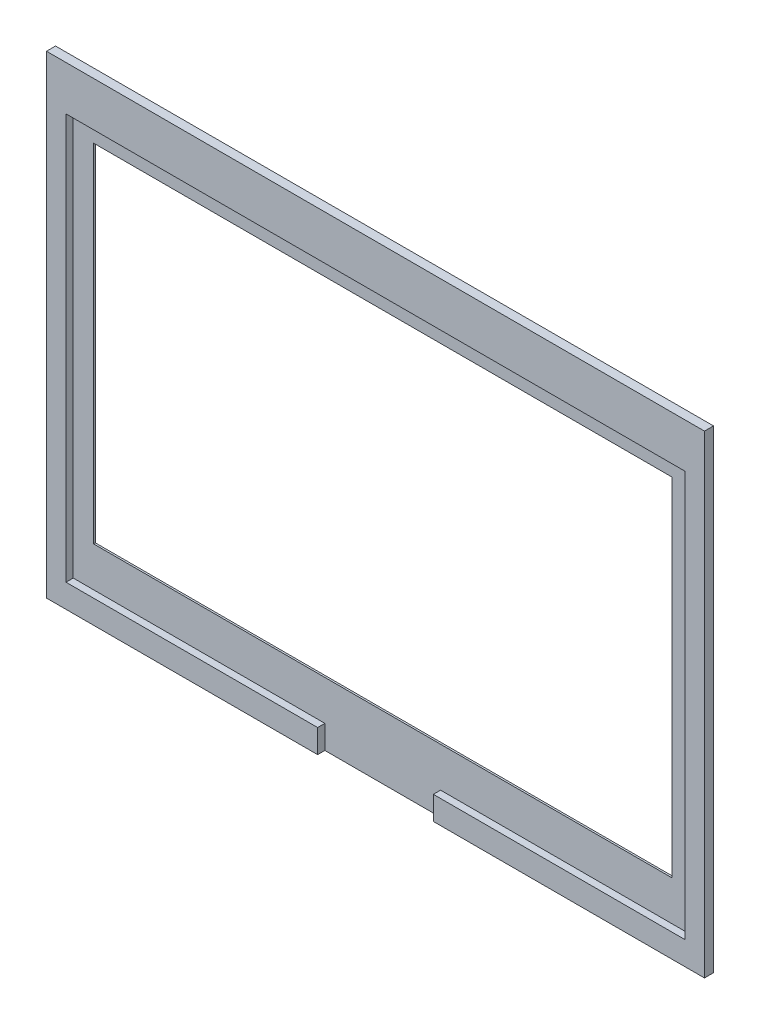
ISO-10303-21;
HEADER;
FILE_DESCRIPTION(('STEP AP214'),'2;1');
FILE_NAME('part.step','',(''),(''),'','','');
FILE_SCHEMA(('AUTOMOTIVE_DESIGN { 1 0 10303 214 1 1 1 1 }'));
ENDSEC;
DATA;
#1=APPLICATION_CONTEXT('core data for automotive mechanical design processes');
#2=APPLICATION_PROTOCOL_DEFINITION('international standard','automotive_design',2000,#1);
#3=PRODUCT_CONTEXT('',#1,'mechanical');
#4=PRODUCT('Part','Part','',(#3));
#5=PRODUCT_RELATED_PRODUCT_CATEGORY('part','',(#4));
#6=PRODUCT_DEFINITION_FORMATION('','',#4);
#7=PRODUCT_DEFINITION_CONTEXT('part definition',#1,'design');
#8=PRODUCT_DEFINITION('design','',#6,#7);
#9=PRODUCT_DEFINITION_SHAPE('','',#8);
#10=(LENGTH_UNIT() NAMED_UNIT(*) SI_UNIT(.MILLI.,.METRE.));
#11=(NAMED_UNIT(*) PLANE_ANGLE_UNIT() SI_UNIT($,.RADIAN.));
#12=(NAMED_UNIT(*) SI_UNIT($,.STERADIAN.) SOLID_ANGLE_UNIT());
#13=UNCERTAINTY_MEASURE_WITH_UNIT(LENGTH_MEASURE(1.E-05),#10,'distance_accuracy_value','');
#14=(GEOMETRIC_REPRESENTATION_CONTEXT(3) GLOBAL_UNCERTAINTY_ASSIGNED_CONTEXT((#13)) GLOBAL_UNIT_ASSIGNED_CONTEXT((#10,
#11,#12)) REPRESENTATION_CONTEXT('',''));
#15=CARTESIAN_POINT('',(0.,0.,0.));
#16=DIRECTION('',(0.,0.,1.));
#17=DIRECTION('',(1.,0.,0.));
#18=AXIS2_PLACEMENT_3D('',#15,#16,#17);
#19=CARTESIAN_POINT('',(0.,6.49999999999999,2.5));
#20=DIRECTION('',(0.,1.,0.));
#21=DIRECTION('',(0.,0.,1.));
#22=AXIS2_PLACEMENT_3D('',#19,#20,#21);
#23=PLANE('',#22);
#24=DIRECTION('',(0.,0.,1.));
#25=VECTOR('',#24,1.);
#26=CARTESIAN_POINT('',(75.,6.49999999999999,0.499999999999996));
#27=LINE('',#26,#25);
#28=CARTESIAN_POINT('',(75.,6.49999999999999,0.499999999999996));
#29=VERTEX_POINT('',#28);
#30=CARTESIAN_POINT('',(75.,6.49999999999999,2.5));
#31=VERTEX_POINT('',#30);
#32=EDGE_CURVE('E175',#29,#31,#27,.T.);
#33=ORIENTED_EDGE('',*,*,#32,.F.);
#34=DIRECTION('',(1.,0.,0.));
#35=VECTOR('',#34,1.);
#36=CARTESIAN_POINT('',(0.,6.49999999999999,0.5));
#37=LINE('',#36,#35);
#38=CARTESIAN_POINT('',(5.40000000000003,6.49999999999999,0.5));
#39=VERTEX_POINT('',#38);
#40=EDGE_CURVE('E189',#39,#29,#37,.T.);
#41=ORIENTED_EDGE('',*,*,#40,.F.);
#42=DIRECTION('',(0.,0.,-1.));
#43=VECTOR('',#42,1.);
#44=CARTESIAN_POINT('',(5.40000000000003,6.49999999999999,2.5));
#45=LINE('',#44,#43);
#46=CARTESIAN_POINT('',(5.40000000000003,6.49999999999999,2.5));
#47=VERTEX_POINT('',#46);
#48=EDGE_CURVE('E260',#47,#39,#45,.T.);
#49=ORIENTED_EDGE('',*,*,#48,.F.);
#50=DIRECTION('',(1.,0.,0.));
#51=VECTOR('',#50,1.);
#52=CARTESIAN_POINT('',(0.,6.49999999999999,2.5));
#53=LINE('',#52,#51);
#54=EDGE_CURVE('E240',#47,#31,#53,.T.);
#55=ORIENTED_EDGE('',*,*,#54,.T.);
#56=EDGE_LOOP('',(#33,#41,#49,#55));
#57=FACE_BOUND('',#56,.T.);
#58=ADVANCED_FACE('F37',(#57),#23,.T.);
#59=CARTESIAN_POINT('',(0.,118.7,2.5));
#60=DIRECTION('',(0.,1.,0.));
#61=DIRECTION('',(0.,0.,1.));
#62=AXIS2_PLACEMENT_3D('',#59,#60,#61);
#63=PLANE('',#62);
#64=DIRECTION('',(0.,0.,-1.));
#65=VECTOR('',#64,1.);
#66=CARTESIAN_POINT('',(5.40000000000001,118.7,2.5));
#67=LINE('',#66,#65);
#68=CARTESIAN_POINT('',(5.40000000000001,118.7,2.5));
#69=VERTEX_POINT('',#68);
#70=CARTESIAN_POINT('',(5.40000000000001,118.7,0.5));
#71=VERTEX_POINT('',#70);
#72=EDGE_CURVE('E258',#69,#71,#67,.T.);
#73=ORIENTED_EDGE('',*,*,#72,.T.);
#74=DIRECTION('',(1.,0.,0.));
#75=VECTOR('',#74,1.);
#76=CARTESIAN_POINT('',(0.,118.7,0.5));
#77=LINE('',#76,#75);
#78=CARTESIAN_POINT('',(176.6,118.7,0.5));
#79=VERTEX_POINT('',#78);
#80=EDGE_CURVE('E60',#71,#79,#77,.T.);
#81=ORIENTED_EDGE('',*,*,#80,.T.);
#82=DIRECTION('',(0.,0.,-1.));
#83=VECTOR('',#82,1.);
#84=CARTESIAN_POINT('',(176.6,118.7,2.5));
#85=LINE('',#84,#83);
#86=CARTESIAN_POINT('',(176.6,118.7,2.5));
#87=VERTEX_POINT('',#86);
#88=EDGE_CURVE('E266',#87,#79,#85,.T.);
#89=ORIENTED_EDGE('',*,*,#88,.F.);
#90=DIRECTION('',(1.,0.,0.));
#91=VECTOR('',#90,1.);
#92=CARTESIAN_POINT('',(0.,118.7,2.5));
#93=LINE('',#92,#91);
#94=EDGE_CURVE('E233',#69,#87,#93,.T.);
#95=ORIENTED_EDGE('',*,*,#94,.F.);
#96=EDGE_LOOP('',(#73,#81,#89,#95));
#97=FACE_BOUND('',#96,.T.);
#98=ADVANCED_FACE('F288',(#97),#63,.F.);
#99=CARTESIAN_POINT('',(176.6,0.,2.5));
#100=DIRECTION('',(1.,0.,0.));
#101=DIRECTION('',(0.,0.,-1.));
#102=AXIS2_PLACEMENT_3D('',#99,#100,#101);
#103=PLANE('',#102);
#104=ORIENTED_EDGE('',*,*,#88,.T.);
#105=DIRECTION('',(0.,-1.,0.));
#106=VECTOR('',#105,1.);
#107=CARTESIAN_POINT('',(176.6,0.,0.5));
#108=LINE('',#107,#106);
#109=CARTESIAN_POINT('',(176.6,6.49999999999999,0.5));
#110=VERTEX_POINT('',#109);
#111=EDGE_CURVE('E180',#79,#110,#108,.T.);
#112=ORIENTED_EDGE('',*,*,#111,.T.);
#113=DIRECTION('',(0.,0.,-1.));
#114=VECTOR('',#113,1.);
#115=CARTESIAN_POINT('',(176.6,6.49999999999999,2.5));
#116=LINE('',#115,#114);
#117=CARTESIAN_POINT('',(176.6,6.49999999999999,2.5));
#118=VERTEX_POINT('',#117);
#119=EDGE_CURVE('E263',#118,#110,#116,.T.);
#120=ORIENTED_EDGE('',*,*,#119,.F.);
#121=DIRECTION('',(0.,-1.,0.));
#122=VECTOR('',#121,1.);
#123=CARTESIAN_POINT('',(176.6,0.,2.5));
#124=LINE('',#123,#122);
#125=EDGE_CURVE('E236',#87,#118,#124,.T.);
#126=ORIENTED_EDGE('',*,*,#125,.F.);
#127=EDGE_LOOP('',(#104,#112,#120,#126));
#128=FACE_BOUND('',#127,.T.);
#129=ADVANCED_FACE('F284',(#128),#103,.F.);
#130=DIRECTION('',(0.,0.,-1.));
#131=VECTOR('',#130,1.);
#132=CARTESIAN_POINT('',(107.,6.49999999999999,0.499999999999988));
#133=LINE('',#132,#131);
#134=CARTESIAN_POINT('',(107.,6.49999999999999,2.5));
#135=VERTEX_POINT('',#134);
#136=CARTESIAN_POINT('',(107.,6.49999999999999,0.5));
#137=VERTEX_POINT('',#136);
#138=EDGE_CURVE('E154',#135,#137,#133,.T.);
#139=ORIENTED_EDGE('',*,*,#138,.F.);
#140=EDGE_CURVE('E239',#135,#118,#53,.T.);
#141=ORIENTED_EDGE('',*,*,#140,.T.);
#142=ORIENTED_EDGE('',*,*,#119,.T.);
#143=EDGE_CURVE('E188',#137,#110,#37,.T.);
#144=ORIENTED_EDGE('',*,*,#143,.F.);
#145=EDGE_LOOP('',(#139,#141,#142,#144));
#146=FACE_BOUND('',#145,.T.);
#147=ADVANCED_FACE('F277',(#146),#23,.T.);
#148=CARTESIAN_POINT('',(0.,0.,2.5));
#149=DIRECTION('',(0.,1.,0.));
#150=DIRECTION('',(0.,0.,1.));
#151=AXIS2_PLACEMENT_3D('',#148,#149,#150);
#152=PLANE('',#151);
#153=DIRECTION('',(-1.,0.,0.));
#154=VECTOR('',#153,1.);
#155=CARTESIAN_POINT('',(75.,0.,0.499999999999996));
#156=LINE('',#155,#154);
#157=CARTESIAN_POINT('',(107.,0.,0.499999999999988));
#158=VERTEX_POINT('',#157);
#159=CARTESIAN_POINT('',(75.,0.,0.499999999999996));
#160=VERTEX_POINT('',#159);
#161=EDGE_CURVE('E157',#158,#160,#156,.T.);
#162=ORIENTED_EDGE('',*,*,#161,.T.);
#163=DIRECTION('',(0.,0.,1.));
#164=VECTOR('',#163,1.);
#165=CARTESIAN_POINT('',(75.,0.,0.499999999999996));
#166=LINE('',#165,#164);
#167=CARTESIAN_POINT('',(75.,0.,2.5));
#168=VERTEX_POINT('',#167);
#169=EDGE_CURVE('E171',#160,#168,#166,.T.);
#170=ORIENTED_EDGE('',*,*,#169,.T.);
#171=DIRECTION('',(1.,0.,0.));
#172=VECTOR('',#171,1.);
#173=CARTESIAN_POINT('',(0.,0.,2.5));
#174=LINE('',#173,#172);
#175=CARTESIAN_POINT('',(0.,0.,2.5));
#176=VERTEX_POINT('',#175);
#177=EDGE_CURVE('E222',#176,#168,#174,.T.);
#178=ORIENTED_EDGE('',*,*,#177,.F.);
#179=DIRECTION('',(0.,0.,-1.));
#180=VECTOR('',#179,1.);
#181=CARTESIAN_POINT('',(0.,0.,2.5));
#182=LINE('',#181,#180);
#183=CARTESIAN_POINT('',(0.,0.,0.));
#184=VERTEX_POINT('',#183);
#185=EDGE_CURVE('E246',#176,#184,#182,.T.);
#186=ORIENTED_EDGE('',*,*,#185,.T.);
#187=DIRECTION('',(1.,0.,0.));
#188=VECTOR('',#187,1.);
#189=CARTESIAN_POINT('',(0.,0.,0.));
#190=LINE('',#189,#188);
#191=CARTESIAN_POINT('',(182.,0.,0.));
#192=VERTEX_POINT('',#191);
#193=EDGE_CURVE('E221',#184,#192,#190,.T.);
#194=ORIENTED_EDGE('',*,*,#193,.T.);
#195=DIRECTION('',(0.,0.,-1.));
#196=VECTOR('',#195,1.);
#197=CARTESIAN_POINT('',(182.,0.,2.5));
#198=LINE('',#197,#196);
#199=CARTESIAN_POINT('',(182.,0.,2.5));
#200=VERTEX_POINT('',#199);
#201=EDGE_CURVE('E261',#200,#192,#198,.T.);
#202=ORIENTED_EDGE('',*,*,#201,.F.);
#203=CARTESIAN_POINT('',(107.,0.,2.5));
#204=VERTEX_POINT('',#203);
#205=EDGE_CURVE('E170',#204,#200,#174,.T.);
#206=ORIENTED_EDGE('',*,*,#205,.F.);
#207=DIRECTION('',(0.,0.,-1.));
#208=VECTOR('',#207,1.);
#209=CARTESIAN_POINT('',(107.,0.,0.499999999999988));
#210=LINE('',#209,#208);
#211=EDGE_CURVE('E151',#204,#158,#210,.T.);
#212=ORIENTED_EDGE('',*,*,#211,.T.);
#213=EDGE_LOOP('',(#162,#170,#178,#186,#194,#202,#206,#212));
#214=FACE_BOUND('',#213,.T.);
#215=ADVANCED_FACE('F39',(#214),#152,.F.);
#216=CARTESIAN_POINT('',(182.,0.,2.5));
#217=DIRECTION('',(-1.,0.,0.));
#218=DIRECTION('',(0.,0.,1.));
#219=AXIS2_PLACEMENT_3D('',#216,#217,#218);
#220=PLANE('',#219);
#221=DIRECTION('',(0.,1.,0.));
#222=VECTOR('',#221,1.);
#223=CARTESIAN_POINT('',(182.,0.,0.));
#224=LINE('',#223,#222);
#225=CARTESIAN_POINT('',(182.,131.,0.));
#226=VERTEX_POINT('',#225);
#227=EDGE_CURVE('E249',#192,#226,#224,.T.);
#228=ORIENTED_EDGE('',*,*,#227,.T.);
#229=DIRECTION('',(0.,0.,-1.));
#230=VECTOR('',#229,1.);
#231=CARTESIAN_POINT('',(182.,131.,2.5));
#232=LINE('',#231,#230);
#233=CARTESIAN_POINT('',(182.,131.,2.5));
#234=VERTEX_POINT('',#233);
#235=EDGE_CURVE('E271',#234,#226,#232,.T.);
#236=ORIENTED_EDGE('',*,*,#235,.F.);
#237=DIRECTION('',(0.,1.,0.));
#238=VECTOR('',#237,1.);
#239=CARTESIAN_POINT('',(182.,0.,2.5));
#240=LINE('',#239,#238);
#241=EDGE_CURVE('E225',#200,#234,#240,.T.);
#242=ORIENTED_EDGE('',*,*,#241,.F.);
#243=ORIENTED_EDGE('',*,*,#201,.T.);
#244=EDGE_LOOP('',(#228,#236,#242,#243));
#245=FACE_BOUND('',#244,.T.);
#246=ADVANCED_FACE('F308',(#245),#220,.F.);
#247=CARTESIAN_POINT('',(0.,131.,2.5));
#248=DIRECTION('',(0.,1.,0.));
#249=DIRECTION('',(0.,0.,1.));
#250=AXIS2_PLACEMENT_3D('',#247,#248,#249);
#251=PLANE('',#250);
#252=DIRECTION('',(1.,0.,0.));
#253=VECTOR('',#252,1.);
#254=CARTESIAN_POINT('',(0.,131.,0.));
#255=LINE('',#254,#253);
#256=CARTESIAN_POINT('',(0.,131.,0.));
#257=VERTEX_POINT('',#256);
#258=EDGE_CURVE('E252',#257,#226,#255,.T.);
#259=ORIENTED_EDGE('',*,*,#258,.F.);
#260=DIRECTION('',(0.,0.,-1.));
#261=VECTOR('',#260,1.);
#262=CARTESIAN_POINT('',(0.,131.,2.5));
#263=LINE('',#262,#261);
#264=CARTESIAN_POINT('',(0.,131.,2.5));
#265=VERTEX_POINT('',#264);
#266=EDGE_CURVE('E269',#265,#257,#263,.T.);
#267=ORIENTED_EDGE('',*,*,#266,.F.);
#268=DIRECTION('',(1.,0.,0.));
#269=VECTOR('',#268,1.);
#270=CARTESIAN_POINT('',(0.,131.,2.5));
#271=LINE('',#270,#269);
#272=EDGE_CURVE('E227',#265,#234,#271,.T.);
#273=ORIENTED_EDGE('',*,*,#272,.T.);
#274=ORIENTED_EDGE('',*,*,#235,.T.);
#275=EDGE_LOOP('',(#259,#267,#273,#274));
#276=FACE_BOUND('',#275,.T.);
#277=ADVANCED_FACE('F310',(#276),#251,.T.);
#278=CARTESIAN_POINT('',(0.,0.,2.5));
#279=DIRECTION('',(-1.,0.,0.));
#280=DIRECTION('',(0.,0.,1.));
#281=AXIS2_PLACEMENT_3D('',#278,#279,#280);
#282=PLANE('',#281);
#283=DIRECTION('',(0.,1.,0.));
#284=VECTOR('',#283,1.);
#285=CARTESIAN_POINT('',(0.,0.,0.));
#286=LINE('',#285,#284);
#287=EDGE_CURVE('E255',#184,#257,#286,.T.);
#288=ORIENTED_EDGE('',*,*,#287,.F.);
#289=ORIENTED_EDGE('',*,*,#185,.F.);
#290=DIRECTION('',(0.,1.,0.));
#291=VECTOR('',#290,1.);
#292=CARTESIAN_POINT('',(0.,0.,2.5));
#293=LINE('',#292,#291);
#294=EDGE_CURVE('E230',#176,#265,#293,.T.);
#295=ORIENTED_EDGE('',*,*,#294,.T.);
#296=ORIENTED_EDGE('',*,*,#266,.T.);
#297=EDGE_LOOP('',(#288,#289,#295,#296));
#298=FACE_BOUND('',#297,.T.);
#299=ADVANCED_FACE('F299',(#298),#282,.T.);
#300=CARTESIAN_POINT('',(5.40000000000003,0.,2.5));
#301=DIRECTION('',(1.,0.,0.));
#302=DIRECTION('',(0.,1.,0.));
#303=AXIS2_PLACEMENT_3D('',#300,#301,#302);
#304=PLANE('',#303);
#305=DIRECTION('',(0.,-1.,0.));
#306=VECTOR('',#305,1.);
#307=CARTESIAN_POINT('',(5.40000000000003,0.,0.5));
#308=LINE('',#307,#306);
#309=EDGE_CURVE('E185',#71,#39,#308,.T.);
#310=ORIENTED_EDGE('',*,*,#309,.F.);
#311=ORIENTED_EDGE('',*,*,#72,.F.);
#312=DIRECTION('',(0.,-1.,0.));
#313=VECTOR('',#312,1.);
#314=CARTESIAN_POINT('',(5.40000000000003,0.,2.5));
#315=LINE('',#314,#313);
#316=EDGE_CURVE('E243',#69,#47,#315,.T.);
#317=ORIENTED_EDGE('',*,*,#316,.T.);
#318=ORIENTED_EDGE('',*,*,#48,.T.);
#319=EDGE_LOOP('',(#310,#311,#317,#318));
#320=FACE_BOUND('',#319,.T.);
#321=ADVANCED_FACE('F287',(#320),#304,.T.);
#322=CARTESIAN_POINT('',(0.,0.,2.5));
#323=DIRECTION('',(0.,0.,1.));
#324=DIRECTION('',(1.,0.,0.));
#325=AXIS2_PLACEMENT_3D('',#322,#323,#324);
#326=PLANE('',#325);
#327=DIRECTION('',(0.,-1.,0.));
#328=VECTOR('',#327,1.);
#329=CARTESIAN_POINT('',(75.,0.,2.5));
#330=LINE('',#329,#328);
#331=EDGE_CURVE('E11',#31,#168,#330,.T.);
#332=ORIENTED_EDGE('',*,*,#331,.F.);
#333=ORIENTED_EDGE('',*,*,#54,.F.);
#334=ORIENTED_EDGE('',*,*,#316,.F.);
#335=ORIENTED_EDGE('',*,*,#94,.T.);
#336=ORIENTED_EDGE('',*,*,#125,.T.);
#337=ORIENTED_EDGE('',*,*,#140,.F.);
#338=DIRECTION('',(0.,1.,0.));
#339=VECTOR('',#338,1.);
#340=CARTESIAN_POINT('',(107.,0.,2.5));
#341=LINE('',#340,#339);
#342=EDGE_CURVE('E45',#204,#135,#341,.T.);
#343=ORIENTED_EDGE('',*,*,#342,.F.);
#344=ORIENTED_EDGE('',*,*,#205,.T.);
#345=ORIENTED_EDGE('',*,*,#241,.T.);
#346=ORIENTED_EDGE('',*,*,#272,.F.);
#347=ORIENTED_EDGE('',*,*,#294,.F.);
#348=ORIENTED_EDGE('',*,*,#177,.T.);
#349=EDGE_LOOP('',(#332,#333,#334,#335,#336,#337,#343,#344,#345,#346,#347,#348));
#350=FACE_BOUND('',#349,.T.);
#351=ADVANCED_FACE('F279',(#350),#326,.T.);
#352=CARTESIAN_POINT('',(0.,0.,0.));
#353=DIRECTION('',(0.,0.,1.));
#354=DIRECTION('',(1.,0.,0.));
#355=AXIS2_PLACEMENT_3D('',#352,#353,#354);
#356=PLANE('',#355);
#357=ORIENTED_EDGE('',*,*,#193,.F.);
#358=ORIENTED_EDGE('',*,*,#287,.T.);
#359=ORIENTED_EDGE('',*,*,#258,.T.);
#360=ORIENTED_EDGE('',*,*,#227,.F.);
#361=EDGE_LOOP('',(#357,#358,#359,#360));
#362=FACE_BOUND('',#361,.T.);
#363=DIRECTION('',(1.,0.,0.));
#364=VECTOR('',#363,1.);
#365=CARTESIAN_POINT('',(0.,113.5,0.));
#366=LINE('',#365,#364);
#367=CARTESIAN_POINT('',(11.,113.5,0.));
#368=VERTEX_POINT('',#367);
#369=CARTESIAN_POINT('',(171.,113.5,0.));
#370=VERTEX_POINT('',#369);
#371=EDGE_CURVE('E178',#368,#370,#366,.T.);
#372=ORIENTED_EDGE('',*,*,#371,.F.);
#373=DIRECTION('',(0.,-1.,0.));
#374=VECTOR('',#373,1.);
#375=CARTESIAN_POINT('',(11.,0.,0.));
#376=LINE('',#375,#374);
#377=CARTESIAN_POINT('',(11.,17.5,0.));
#378=VERTEX_POINT('',#377);
#379=EDGE_CURVE('E183',#368,#378,#376,.T.);
#380=ORIENTED_EDGE('',*,*,#379,.T.);
#381=DIRECTION('',(1.,0.,0.));
#382=VECTOR('',#381,1.);
#383=CARTESIAN_POINT('',(0.,17.5,0.));
#384=LINE('',#383,#382);
#385=CARTESIAN_POINT('',(171.,17.5,0.));
#386=VERTEX_POINT('',#385);
#387=EDGE_CURVE('E208',#378,#386,#384,.T.);
#388=ORIENTED_EDGE('',*,*,#387,.T.);
#389=DIRECTION('',(0.,-1.,0.));
#390=VECTOR('',#389,1.);
#391=CARTESIAN_POINT('',(171.,0.,0.));
#392=LINE('',#391,#390);
#393=EDGE_CURVE('E205',#370,#386,#392,.T.);
#394=ORIENTED_EDGE('',*,*,#393,.F.);
#395=EDGE_LOOP('',(#372,#380,#388,#394));
#396=FACE_BOUND('',#395,.T.);
#397=ADVANCED_FACE('F303',(#362,#396),#356,.F.);
#398=CARTESIAN_POINT('',(0.,113.5,0.5));
#399=DIRECTION('',(0.,1.,0.));
#400=DIRECTION('',(-1.,0.,0.));
#401=AXIS2_PLACEMENT_3D('',#398,#399,#400);
#402=PLANE('',#401);
#403=ORIENTED_EDGE('',*,*,#371,.T.);
#404=DIRECTION('',(0.,0.,-1.));
#405=VECTOR('',#404,1.);
#406=CARTESIAN_POINT('',(171.,113.5,0.5));
#407=LINE('',#406,#405);
#408=CARTESIAN_POINT('',(171.,113.5,0.5));
#409=VERTEX_POINT('',#408);
#410=EDGE_CURVE('E218',#409,#370,#407,.T.);
#411=ORIENTED_EDGE('',*,*,#410,.F.);
#412=DIRECTION('',(1.,0.,0.));
#413=VECTOR('',#412,1.);
#414=CARTESIAN_POINT('',(0.,113.5,0.5));
#415=LINE('',#414,#413);
#416=CARTESIAN_POINT('',(11.,113.5,0.5));
#417=VERTEX_POINT('',#416);
#418=EDGE_CURVE('E191',#417,#409,#415,.T.);
#419=ORIENTED_EDGE('',*,*,#418,.F.);
#420=DIRECTION('',(0.,0.,-1.));
#421=VECTOR('',#420,1.);
#422=CARTESIAN_POINT('',(11.,113.5,0.5));
#423=LINE('',#422,#421);
#424=EDGE_CURVE('E202',#417,#368,#423,.T.);
#425=ORIENTED_EDGE('',*,*,#424,.T.);
#426=EDGE_LOOP('',(#403,#411,#419,#425));
#427=FACE_BOUND('',#426,.T.);
#428=ADVANCED_FACE('F416',(#427),#402,.F.);
#429=CARTESIAN_POINT('',(171.,0.,0.5));
#430=DIRECTION('',(1.,0.,0.));
#431=DIRECTION('',(0.,0.,-1.));
#432=AXIS2_PLACEMENT_3D('',#429,#430,#431);
#433=PLANE('',#432);
#434=ORIENTED_EDGE('',*,*,#393,.T.);
#435=DIRECTION('',(0.,0.,-1.));
#436=VECTOR('',#435,1.);
#437=CARTESIAN_POINT('',(171.,17.5,0.5));
#438=LINE('',#437,#436);
#439=CARTESIAN_POINT('',(171.,17.5,0.5));
#440=VERTEX_POINT('',#439);
#441=EDGE_CURVE('E216',#440,#386,#438,.T.);
#442=ORIENTED_EDGE('',*,*,#441,.F.);
#443=DIRECTION('',(0.,-1.,0.));
#444=VECTOR('',#443,1.);
#445=CARTESIAN_POINT('',(171.,0.,0.5));
#446=LINE('',#445,#444);
#447=EDGE_CURVE('E194',#409,#440,#446,.T.);
#448=ORIENTED_EDGE('',*,*,#447,.F.);
#449=ORIENTED_EDGE('',*,*,#410,.T.);
#450=EDGE_LOOP('',(#434,#442,#448,#449));
#451=FACE_BOUND('',#450,.T.);
#452=ADVANCED_FACE('F412',(#451),#433,.F.);
#453=CARTESIAN_POINT('',(0.,17.5,0.5));
#454=DIRECTION('',(0.,1.,0.));
#455=DIRECTION('',(-1.,0.,0.));
#456=AXIS2_PLACEMENT_3D('',#453,#454,#455);
#457=PLANE('',#456);
#458=ORIENTED_EDGE('',*,*,#387,.F.);
#459=DIRECTION('',(0.,0.,-1.));
#460=VECTOR('',#459,1.);
#461=CARTESIAN_POINT('',(11.,17.5,0.5));
#462=LINE('',#461,#460);
#463=CARTESIAN_POINT('',(11.,17.5,0.5));
#464=VERTEX_POINT('',#463);
#465=EDGE_CURVE('E214',#464,#378,#462,.T.);
#466=ORIENTED_EDGE('',*,*,#465,.F.);
#467=DIRECTION('',(1.,0.,0.));
#468=VECTOR('',#467,1.);
#469=CARTESIAN_POINT('',(0.,17.5,0.5));
#470=LINE('',#469,#468);
#471=EDGE_CURVE('E196',#464,#440,#470,.T.);
#472=ORIENTED_EDGE('',*,*,#471,.T.);
#473=ORIENTED_EDGE('',*,*,#441,.T.);
#474=EDGE_LOOP('',(#458,#466,#472,#473));
#475=FACE_BOUND('',#474,.T.);
#476=ADVANCED_FACE('F408',(#475),#457,.T.);
#477=CARTESIAN_POINT('',(11.,0.,0.5));
#478=DIRECTION('',(1.,0.,0.));
#479=DIRECTION('',(0.,1.,0.));
#480=AXIS2_PLACEMENT_3D('',#477,#478,#479);
#481=PLANE('',#480);
#482=ORIENTED_EDGE('',*,*,#379,.F.);
#483=ORIENTED_EDGE('',*,*,#424,.F.);
#484=DIRECTION('',(0.,-1.,0.));
#485=VECTOR('',#484,1.);
#486=CARTESIAN_POINT('',(11.,0.,0.5));
#487=LINE('',#486,#485);
#488=EDGE_CURVE('E199',#417,#464,#487,.T.);
#489=ORIENTED_EDGE('',*,*,#488,.T.);
#490=ORIENTED_EDGE('',*,*,#465,.T.);
#491=EDGE_LOOP('',(#482,#483,#489,#490));
#492=FACE_BOUND('',#491,.T.);
#493=ADVANCED_FACE('F383',(#492),#481,.T.);
#494=CARTESIAN_POINT('',(0.,0.,0.5));
#495=DIRECTION('',(0.,0.,1.));
#496=DIRECTION('',(1.,0.,0.));
#497=AXIS2_PLACEMENT_3D('',#494,#495,#496);
#498=PLANE('',#497);
#499=ORIENTED_EDGE('',*,*,#111,.F.);
#500=ORIENTED_EDGE('',*,*,#80,.F.);
#501=ORIENTED_EDGE('',*,*,#309,.T.);
#502=ORIENTED_EDGE('',*,*,#40,.T.);
#503=DIRECTION('',(0.,1.,0.));
#504=VECTOR('',#503,1.);
#505=CARTESIAN_POINT('',(75.,0.,0.499999999999996));
#506=LINE('',#505,#504);
#507=EDGE_CURVE('E156',#160,#29,#506,.T.);
#508=ORIENTED_EDGE('',*,*,#507,.F.);
#509=ORIENTED_EDGE('',*,*,#161,.F.);
#510=DIRECTION('',(0.,1.,0.));
#511=VECTOR('',#510,1.);
#512=CARTESIAN_POINT('',(107.,0.,0.499999999999988));
#513=LINE('',#512,#511);
#514=EDGE_CURVE('E52',#158,#137,#513,.T.);
#515=ORIENTED_EDGE('',*,*,#514,.T.);
#516=ORIENTED_EDGE('',*,*,#143,.T.);
#517=EDGE_LOOP('',(#499,#500,#501,#502,#508,#509,#515,#516));
#518=FACE_BOUND('',#517,.T.);
#519=ORIENTED_EDGE('',*,*,#418,.T.);
#520=ORIENTED_EDGE('',*,*,#447,.T.);
#521=ORIENTED_EDGE('',*,*,#471,.F.);
#522=ORIENTED_EDGE('',*,*,#488,.F.);
#523=EDGE_LOOP('',(#519,#520,#521,#522));
#524=FACE_BOUND('',#523,.T.);
#525=ADVANCED_FACE('F161',(#518,#524),#498,.T.);
#526=CARTESIAN_POINT('',(75.,0.,0.499999999999996));
#527=DIRECTION('',(-1.,0.,0.));
#528=DIRECTION('',(0.,0.,1.));
#529=AXIS2_PLACEMENT_3D('',#526,#527,#528);
#530=PLANE('',#529);
#531=ORIENTED_EDGE('',*,*,#331,.T.);
#532=ORIENTED_EDGE('',*,*,#169,.F.);
#533=ORIENTED_EDGE('',*,*,#507,.T.);
#534=ORIENTED_EDGE('',*,*,#32,.T.);
#535=EDGE_LOOP('',(#531,#532,#533,#534));
#536=FACE_BOUND('',#535,.T.);
#537=ADVANCED_FACE('F293',(#536),#530,.F.);
#538=CARTESIAN_POINT('',(107.,0.,0.499999999999988));
#539=DIRECTION('',(1.,0.,0.));
#540=DIRECTION('',(0.,0.,-1.));
#541=AXIS2_PLACEMENT_3D('',#538,#539,#540);
#542=PLANE('',#541);
#543=ORIENTED_EDGE('',*,*,#342,.T.);
#544=ORIENTED_EDGE('',*,*,#138,.T.);
#545=ORIENTED_EDGE('',*,*,#514,.F.);
#546=ORIENTED_EDGE('',*,*,#211,.F.);
#547=EDGE_LOOP('',(#543,#544,#545,#546));
#548=FACE_BOUND('',#547,.T.);
#549=ADVANCED_FACE('F149',(#548),#542,.F.);
#550=CLOSED_SHELL('',(#58,#98,#129,#147,#215,#246,#277,#299,#321,#351,#397,#428,#452,#476,#493,
#525,#537,#549));
#551=MANIFOLD_SOLID_BREP('B2',#550);
#552=ADVANCED_BREP_SHAPE_REPRESENTATION('',(#18,#551),#14);
#553=SHAPE_DEFINITION_REPRESENTATION(#9,#552);
ENDSEC;
END-ISO-10303-21;
